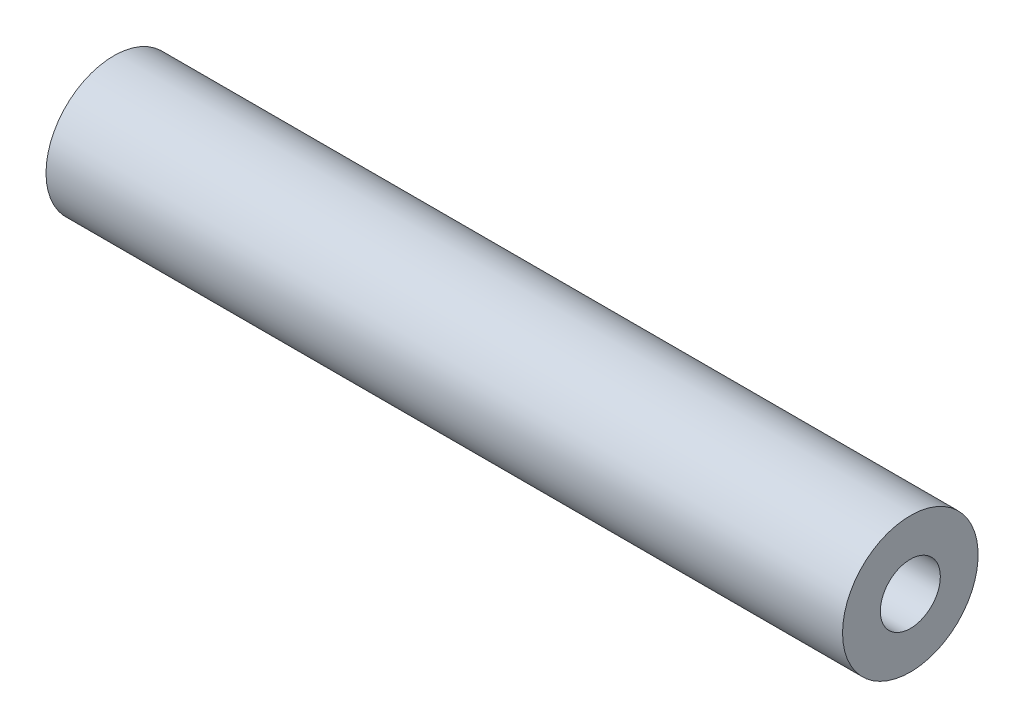
ISO-10303-21;
HEADER;
FILE_DESCRIPTION(('STEP AP214'),'2;1');
FILE_NAME('part.step','',(''),(''),'','','');
FILE_SCHEMA(('AUTOMOTIVE_DESIGN { 1 0 10303 214 1 1 1 1 }'));
ENDSEC;
DATA;
#1=APPLICATION_CONTEXT('core data for automotive mechanical design processes');
#2=APPLICATION_PROTOCOL_DEFINITION('international standard','automotive_design',2000,#1);
#3=PRODUCT_CONTEXT('',#1,'mechanical');
#4=PRODUCT('Part','Part','',(#3));
#5=PRODUCT_RELATED_PRODUCT_CATEGORY('part','',(#4));
#6=PRODUCT_DEFINITION_FORMATION('','',#4);
#7=PRODUCT_DEFINITION_CONTEXT('part definition',#1,'design');
#8=PRODUCT_DEFINITION('design','',#6,#7);
#9=PRODUCT_DEFINITION_SHAPE('','',#8);
#10=(LENGTH_UNIT() NAMED_UNIT(*) SI_UNIT(.MILLI.,.METRE.));
#11=(NAMED_UNIT(*) PLANE_ANGLE_UNIT() SI_UNIT($,.RADIAN.));
#12=(NAMED_UNIT(*) SI_UNIT($,.STERADIAN.) SOLID_ANGLE_UNIT());
#13=UNCERTAINTY_MEASURE_WITH_UNIT(LENGTH_MEASURE(1.E-05),#10,'distance_accuracy_value','');
#14=(GEOMETRIC_REPRESENTATION_CONTEXT(3) GLOBAL_UNCERTAINTY_ASSIGNED_CONTEXT((#13)) GLOBAL_UNIT_ASSIGNED_CONTEXT((#10,
#11,#12)) REPRESENTATION_CONTEXT('',''));
#15=CARTESIAN_POINT('',(0.,0.,0.));
#16=DIRECTION('',(0.,0.,1.));
#17=DIRECTION('',(1.,0.,0.));
#18=AXIS2_PLACEMENT_3D('',#15,#16,#17);
#19=CARTESIAN_POINT('',(59.69,0.,0.));
#20=DIRECTION('',(-1.,0.,0.));
#21=DIRECTION('',(0.,0.,1.));
#22=AXIS2_PLACEMENT_3D('',#19,#20,#21);
#23=CYLINDRICAL_SURFACE('',#22,5.08);
#24=CARTESIAN_POINT('',(59.69,0.,0.));
#25=DIRECTION('',(1.,0.,0.));
#26=DIRECTION('',(0.,0.,-1.));
#27=AXIS2_PLACEMENT_3D('',#24,#25,#26);
#28=CIRCLE('',#27,5.08);
#29=CARTESIAN_POINT('',(59.69,0.,5.08));
#30=VERTEX_POINT('',#29);
#31=EDGE_CURVE('E10',#30,#30,#28,.T.);
#32=CARTESIAN_POINT('',(0.,0.,0.));
#33=DIRECTION('',(1.,0.,0.));
#34=DIRECTION('',(0.,0.,-1.));
#35=AXIS2_PLACEMENT_3D('',#32,#33,#34);
#36=CIRCLE('',#35,5.08);
#37=CARTESIAN_POINT('',(0.,0.,5.08));
#38=VERTEX_POINT('',#37);
#39=EDGE_CURVE('E34',#38,#38,#36,.T.);
#40=CARTESIAN_POINT('',(59.69,0.,5.08));
#41=CARTESIAN_POINT('',(59.0682291666667,0.,5.08));
#42=CARTESIAN_POINT('',(58.4464583333333,0.,5.08));
#43=CARTESIAN_POINT('',(57.2029166666667,0.,5.08));
#44=CARTESIAN_POINT('',(56.5811458333333,0.,5.08));
#45=CARTESIAN_POINT('',(55.3376041666667,0.,5.08));
#46=CARTESIAN_POINT('',(54.7158333333333,0.,5.08));
#47=CARTESIAN_POINT('',(53.4722916666667,0.,5.08));
#48=CARTESIAN_POINT('',(52.8505208333333,0.,5.08));
#49=CARTESIAN_POINT('',(51.6069791666667,0.,5.08));
#50=CARTESIAN_POINT('',(50.9852083333333,0.,5.08));
#51=CARTESIAN_POINT('',(49.7416666666667,0.,5.08));
#52=CARTESIAN_POINT('',(49.1198958333333,0.,5.08));
#53=CARTESIAN_POINT('',(47.8763541666667,0.,5.08));
#54=CARTESIAN_POINT('',(47.2545833333333,0.,5.08));
#55=CARTESIAN_POINT('',(46.0110416666667,0.,5.08));
#56=CARTESIAN_POINT('',(45.3892708333333,0.,5.08));
#57=CARTESIAN_POINT('',(44.1457291666667,0.,5.08));
#58=CARTESIAN_POINT('',(43.5239583333333,0.,5.08));
#59=CARTESIAN_POINT('',(42.2804166666667,0.,5.08));
#60=CARTESIAN_POINT('',(41.6586458333333,0.,5.08));
#61=CARTESIAN_POINT('',(40.4151041666667,0.,5.08));
#62=CARTESIAN_POINT('',(39.7933333333333,0.,5.08));
#63=CARTESIAN_POINT('',(38.5497916666667,0.,5.08));
#64=CARTESIAN_POINT('',(37.9280208333333,0.,5.08));
#65=CARTESIAN_POINT('',(36.6844791666667,0.,5.08));
#66=CARTESIAN_POINT('',(36.0627083333333,0.,5.08));
#67=CARTESIAN_POINT('',(34.8191666666667,0.,5.08));
#68=CARTESIAN_POINT('',(34.1973958333333,0.,5.08));
#69=CARTESIAN_POINT('',(32.9538541666667,0.,5.08));
#70=CARTESIAN_POINT('',(32.3320833333333,0.,5.08));
#71=CARTESIAN_POINT('',(31.0885416666667,0.,5.08));
#72=CARTESIAN_POINT('',(30.4667708333333,0.,5.08));
#73=CARTESIAN_POINT('',(29.2232291666667,0.,5.08));
#74=CARTESIAN_POINT('',(28.6014583333333,0.,5.08));
#75=CARTESIAN_POINT('',(27.3579166666667,0.,5.08));
#76=CARTESIAN_POINT('',(26.7361458333333,0.,5.08));
#77=CARTESIAN_POINT('',(25.4926041666667,0.,5.08));
#78=CARTESIAN_POINT('',(24.8708333333333,0.,5.08));
#79=CARTESIAN_POINT('',(23.6272916666667,0.,5.08));
#80=CARTESIAN_POINT('',(23.0055208333333,0.,5.08));
#81=CARTESIAN_POINT('',(21.7619791666667,0.,5.08));
#82=CARTESIAN_POINT('',(21.1402083333333,0.,5.08));
#83=CARTESIAN_POINT('',(19.8966666666667,0.,5.08));
#84=CARTESIAN_POINT('',(19.2748958333333,0.,5.08));
#85=CARTESIAN_POINT('',(18.0313541666667,0.,5.08));
#86=CARTESIAN_POINT('',(17.4095833333333,0.,5.08));
#87=CARTESIAN_POINT('',(16.1660416666667,0.,5.08));
#88=CARTESIAN_POINT('',(15.5442708333333,0.,5.08));
#89=CARTESIAN_POINT('',(14.3007291666667,0.,5.08));
#90=CARTESIAN_POINT('',(13.6789583333333,0.,5.08));
#91=CARTESIAN_POINT('',(12.4354166666667,0.,5.08));
#92=CARTESIAN_POINT('',(11.8136458333333,0.,5.08));
#93=CARTESIAN_POINT('',(10.5701041666667,0.,5.08));
#94=CARTESIAN_POINT('',(9.94833333333334,0.,5.08));
#95=CARTESIAN_POINT('',(8.70479166666667,0.,5.08));
#96=CARTESIAN_POINT('',(8.08302083333334,0.,5.08));
#97=CARTESIAN_POINT('',(6.83947916666667,0.,5.08));
#98=CARTESIAN_POINT('',(6.21770833333334,0.,5.08));
#99=CARTESIAN_POINT('',(4.97416666666667,0.,5.08));
#100=CARTESIAN_POINT('',(4.35239583333334,0.,5.08));
#101=CARTESIAN_POINT('',(3.10885416666667,0.,5.08));
#102=CARTESIAN_POINT('',(2.48708333333333,0.,5.08));
#103=CARTESIAN_POINT('',(1.24354166666667,0.,5.08));
#104=CARTESIAN_POINT('',(0.621770833333332,0.,5.08));
#105=CARTESIAN_POINT('',(0.,0.,5.08));
#106=B_SPLINE_CURVE_WITH_KNOTS('',3,(#40,#41,#42,#43,#44,#45,#46,#47,#48,#49,#50,#51,#52,#53,
#54,#55,#56,#57,#58,#59,#60,#61,#62,#63,#64,#65,#66,#67,#68,#69,#70,#71,#72,#73,#74,#75,#76,#77,
#78,#79,#80,#81,#82,#83,#84,#85,#86,#87,#88,#89,#90,#91,#92,#93,#94,#95,#96,#97,#98,#99,#100,
#101,#102,#103,#104,#105),.UNSPECIFIED.,.F.,.F.,(4,2,2,2,2,2,2,2,2,2,2,2,2,2,2,2,2,2,2,2,2,2,2,
2,2,2,2,2,2,2,2,2,4),(0.,1.8653125,3.730625,5.5959375,7.46125,9.3265625,11.191875,13.0571875,
14.9225,16.7878125,18.653125,20.5184375,22.38375,24.2490625,26.114375,27.9796875,29.845,
31.7103125,33.575625,35.4409375,37.30625,39.1715625,41.036875,42.9021875,44.7675,46.6328125,
48.498125,50.3634375,52.22875,54.0940625,55.959375,57.8246875,59.69),.UNSPECIFIED.);
#107=EDGE_CURVE('BSEAM31',#30,#38,#106,.T.);
#108=ORIENTED_EDGE('',*,*,#31,.F.);
#109=ORIENTED_EDGE('',*,*,#39,.T.);
#110=ORIENTED_EDGE('',*,*,#107,.T.);
#111=ORIENTED_EDGE('',*,*,#107,.F.);
#112=EDGE_LOOP('',(#108,#110,#109,#111));
#113=FACE_BOUND('',#112,.T.);
#114=ADVANCED_FACE('F31',(#113),#23,.T.);
#115=CARTESIAN_POINT('',(59.69,0.,0.));
#116=DIRECTION('',(1.,0.,0.));
#117=DIRECTION('',(0.,0.,-1.));
#118=AXIS2_PLACEMENT_3D('',#115,#116,#117);
#119=PLANE('',#118);
#120=CARTESIAN_POINT('',(59.69,0.,0.));
#121=DIRECTION('',(1.,0.,0.));
#122=DIRECTION('',(0.,0.,-1.));
#123=AXIS2_PLACEMENT_3D('',#120,#121,#122);
#124=CIRCLE('',#123,2.24789999999999);
#125=CARTESIAN_POINT('',(59.69,0.,-2.24789999999999));
#126=VERTEX_POINT('',#125);
#127=EDGE_CURVE('E45',#126,#126,#124,.T.);
#128=ORIENTED_EDGE('',*,*,#127,.F.);
#129=EDGE_LOOP('',(#128));
#130=FACE_BOUND('',#129,.T.);
#131=ORIENTED_EDGE('',*,*,#31,.T.);
#132=EDGE_LOOP('',(#131));
#133=FACE_BOUND('',#132,.T.);
#134=ADVANCED_FACE('F51',(#130,#133),#119,.T.);
#135=CARTESIAN_POINT('',(0.,0.,0.));
#136=DIRECTION('',(1.,0.,0.));
#137=DIRECTION('',(0.,0.,-1.));
#138=AXIS2_PLACEMENT_3D('',#135,#136,#137);
#139=PLANE('',#138);
#140=CARTESIAN_POINT('',(0.,0.,0.));
#141=DIRECTION('',(1.,0.,0.));
#142=DIRECTION('',(0.,0.,-1.));
#143=AXIS2_PLACEMENT_3D('',#140,#141,#142);
#144=CIRCLE('',#143,2.24789999999998);
#145=CARTESIAN_POINT('',(0.,0.,-2.24789999999998));
#146=VERTEX_POINT('',#145);
#147=EDGE_CURVE('E41',#146,#146,#144,.T.);
#148=ORIENTED_EDGE('',*,*,#147,.T.);
#149=EDGE_LOOP('',(#148));
#150=FACE_BOUND('',#149,.T.);
#151=ORIENTED_EDGE('',*,*,#39,.F.);
#152=EDGE_LOOP('',(#151));
#153=FACE_BOUND('',#152,.T.);
#154=ADVANCED_FACE('F53',(#150,#153),#139,.F.);
#155=CARTESIAN_POINT('',(59.69,0.,0.));
#156=DIRECTION('',(1.,0.,0.));
#157=DIRECTION('',(0.,0.,-1.));
#158=AXIS2_PLACEMENT_3D('',#155,#156,#157);
#159=CYLINDRICAL_SURFACE('',#158,2.24789999999999);
#160=ORIENTED_EDGE('',*,*,#147,.F.);
#161=EDGE_LOOP('',(#160));
#162=FACE_BOUND('',#161,.T.);
#163=ORIENTED_EDGE('',*,*,#127,.T.);
#164=EDGE_LOOP('',(#163));
#165=FACE_BOUND('',#164,.T.);
#166=ADVANCED_FACE('F49',(#162,#165),#159,.F.);
#167=CLOSED_SHELL('',(#114,#134,#154,#166));
#168=MANIFOLD_SOLID_BREP('B2',#167);
#169=ADVANCED_BREP_SHAPE_REPRESENTATION('',(#18,#168),#14);
#170=SHAPE_DEFINITION_REPRESENTATION(#9,#169);
ENDSEC;
END-ISO-10303-21;
